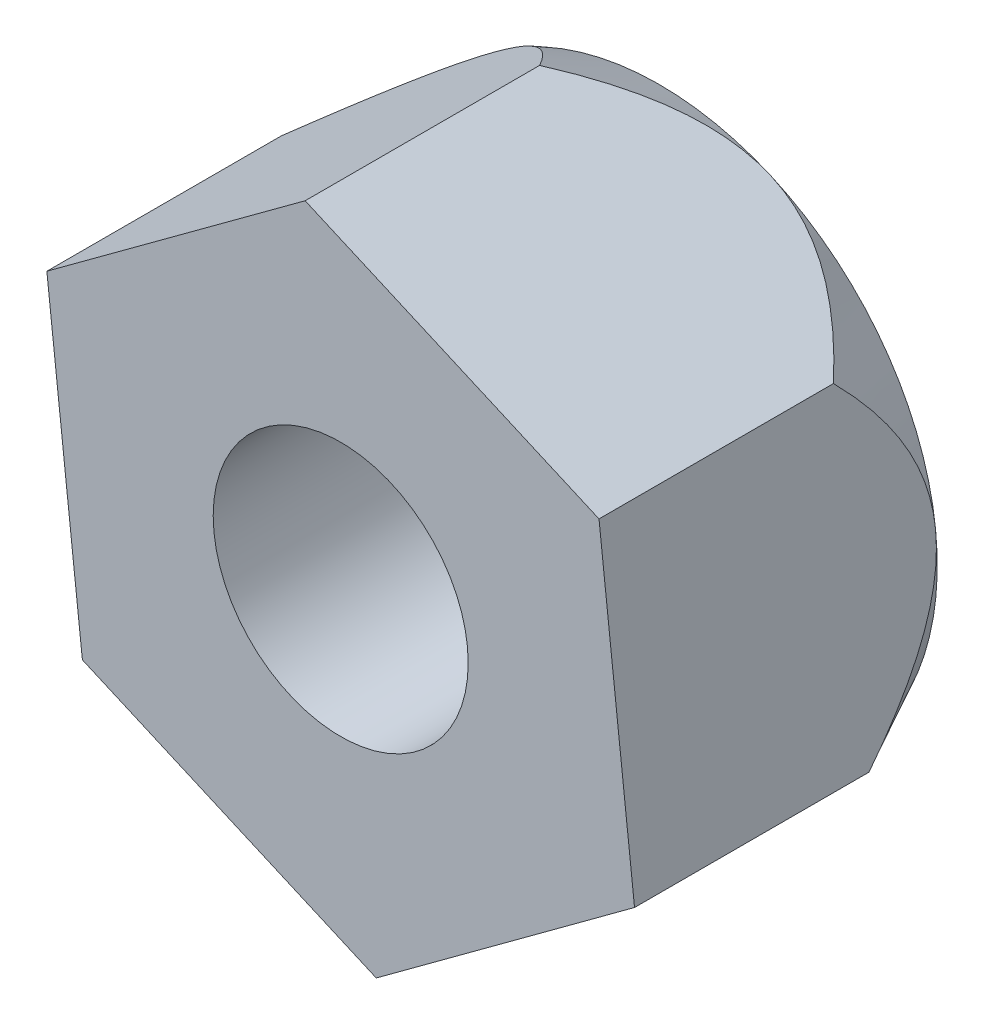
ISO-10303-21;
HEADER;
FILE_DESCRIPTION(('STEP AP214'),'2;1');
FILE_NAME('part.step','',(''),(''),'','','');
FILE_SCHEMA(('AUTOMOTIVE_DESIGN { 1 0 10303 214 1 1 1 1 }'));
ENDSEC;
DATA;
#1=APPLICATION_CONTEXT('core data for automotive mechanical design processes');
#2=APPLICATION_PROTOCOL_DEFINITION('international standard','automotive_design',2000,#1);
#3=PRODUCT_CONTEXT('',#1,'mechanical');
#4=PRODUCT('Part','Part','',(#3));
#5=PRODUCT_RELATED_PRODUCT_CATEGORY('part','',(#4));
#6=PRODUCT_DEFINITION_FORMATION('','',#4);
#7=PRODUCT_DEFINITION_CONTEXT('part definition',#1,'design');
#8=PRODUCT_DEFINITION('design','',#6,#7);
#9=PRODUCT_DEFINITION_SHAPE('','',#8);
#10=(LENGTH_UNIT() NAMED_UNIT(*) SI_UNIT(.MILLI.,.METRE.));
#11=(NAMED_UNIT(*) PLANE_ANGLE_UNIT() SI_UNIT($,.RADIAN.));
#12=(NAMED_UNIT(*) SI_UNIT($,.STERADIAN.) SOLID_ANGLE_UNIT());
#13=UNCERTAINTY_MEASURE_WITH_UNIT(LENGTH_MEASURE(1.E-05),#10,'distance_accuracy_value','');
#14=(GEOMETRIC_REPRESENTATION_CONTEXT(3) GLOBAL_UNCERTAINTY_ASSIGNED_CONTEXT((#13)) GLOBAL_UNIT_ASSIGNED_CONTEXT((#10,
#11,#12)) REPRESENTATION_CONTEXT('',''));
#15=CARTESIAN_POINT('',(0.,0.,0.));
#16=DIRECTION('',(0.,0.,1.));
#17=DIRECTION('',(1.,0.,0.));
#18=AXIS2_PLACEMENT_3D('',#15,#16,#17);
#19=CARTESIAN_POINT('',(0.,0.,0.));
#20=DIRECTION('',(0.,0.,1.));
#21=DIRECTION('',(1.,0.,0.));
#22=AXIS2_PLACEMENT_3D('',#19,#20,#21);
#23=PLANE('',#22);
#24=CARTESIAN_POINT('',(0.,0.,0.));
#25=DIRECTION('',(0.,0.,-1.));
#26=DIRECTION('',(-1.,0.,0.));
#27=AXIS2_PLACEMENT_3D('',#24,#25,#26);
#28=CIRCLE('',#27,2.);
#29=CARTESIAN_POINT('',(-2.,0.,0.));
#30=VERTEX_POINT('',#29);
#31=EDGE_CURVE('E164',#30,#30,#28,.T.);
#32=ORIENTED_EDGE('',*,*,#31,.F.);
#33=EDGE_LOOP('',(#32));
#34=FACE_BOUND('',#33,.T.);
#35=CARTESIAN_POINT('',(0.,0.,0.));
#36=DIRECTION('',(0.,0.,-1.));
#37=DIRECTION('',(-1.,0.,0.));
#38=AXIS2_PLACEMENT_3D('',#35,#36,#37);
#39=CIRCLE('',#38,4.35696877730131);
#40=CARTESIAN_POINT('',(1.7468737262479,3.99144198391049,0.));
#41=VERTEX_POINT('',#40);
#42=CARTESIAN_POINT('',(4.33012701892219,0.482883967820974,0.));
#43=VERTEX_POINT('',#42);
#44=EDGE_CURVE('E152',#41,#43,#39,.T.);
#45=ORIENTED_EDGE('',*,*,#44,.T.);
#46=CARTESIAN_POINT('',(2.58325329267429,-3.50855801608951,0.));
#47=VERTEX_POINT('',#46);
#48=EDGE_CURVE('E141',#43,#47,#39,.T.);
#49=ORIENTED_EDGE('',*,*,#48,.T.);
#50=CARTESIAN_POINT('',(-1.74687372624791,-3.99144198391049,0.));
#51=VERTEX_POINT('',#50);
#52=EDGE_CURVE('E153',#47,#51,#39,.T.);
#53=ORIENTED_EDGE('',*,*,#52,.T.);
#54=CARTESIAN_POINT('',(-4.33012701892219,-0.482883967820975,0.));
#55=VERTEX_POINT('',#54);
#56=EDGE_CURVE('E85',#51,#55,#39,.T.);
#57=ORIENTED_EDGE('',*,*,#56,.T.);
#58=CARTESIAN_POINT('',(-2.58325329267429,3.50855801608951,0.));
#59=VERTEX_POINT('',#58);
#60=EDGE_CURVE('E93',#55,#59,#39,.T.);
#61=ORIENTED_EDGE('',*,*,#60,.T.);
#62=EDGE_CURVE('E172',#59,#41,#39,.T.);
#63=ORIENTED_EDGE('',*,*,#62,.T.);
#64=EDGE_LOOP('',(#45,#49,#53,#57,#61,#63));
#65=FACE_BOUND('',#64,.T.);
#66=ADVANCED_FACE('F64',(#34,#65),#23,.F.);
#67=CARTESIAN_POINT('',(4.33012701892219,0.482883967820974,5.));
#68=DIRECTION('',(-0.993839350302678,-0.110830256653817,0.));
#69=DIRECTION('',(0.110830256653817,-0.993839350302678,0.));
#70=AXIS2_PLACEMENT_3D('',#67,#68,#69);
#71=PLANE('',#70);
#72=CARTESIAN_POINT('',(4.05131152665829,2.98308396782098,1.32304684510144));
#73=CARTESIAN_POINT('',(4.05697597642664,2.93228959769533,1.27289578956966));
#74=CARTESIAN_POINT('',(4.06270317914793,2.8809325080031,1.22332320163949));
#75=CARTESIAN_POINT('',(4.0742984343779,2.77695529751681,1.12550635683434));
#76=CARTESIAN_POINT('',(4.08016652975888,2.72433479227734,1.07726251412321));
#77=CARTESIAN_POINT('',(4.09807421234788,2.56375265372579,0.934233711844905));
#78=CARTESIAN_POINT('',(4.11034670759139,2.45370248270171,0.841783462837));
#79=CARTESIAN_POINT('',(4.13601486940694,2.22353041568287,0.662586395564667));
#80=CARTESIAN_POINT('',(4.14943357137625,2.1032019562015,0.576105574547549));
#81=CARTESIAN_POINT('',(4.17714662756175,1.85469287045311,0.415870591901701));
#82=CARTESIAN_POINT('',(4.19143841332506,1.72653527606945,0.342081326579882));
#83=CARTESIAN_POINT('',(4.21321005166922,1.53130419423075,0.24625814605344));
#84=CARTESIAN_POINT('',(4.22032200964372,1.46752969883432,0.217406500895169));
#85=CARTESIAN_POINT('',(4.23475282176713,1.33812542442336,0.164291655453794));
#86=CARTESIAN_POINT('',(4.24207169887956,1.27249543948986,0.140028966760885));
#87=CARTESIAN_POINT('',(4.26420553120626,1.07401648434333,0.0755143583387216));
#88=CARTESIAN_POINT('',(4.2793198960684,0.938482641795714,0.0429763797723642));
#89=CARTESIAN_POINT('',(4.30237362870574,0.73175473771883,0.013005912123774));
#90=CARTESIAN_POINT('',(4.31017372225658,0.661809578870429,0.00617356568787549));
#91=CARTESIAN_POINT('',(4.32581286145066,0.52156996917169,-0.000775316984884012));
#92=CARTESIAN_POINT('',(4.33365190569912,0.451275530828721,-0.000892091991262691));
#93=CARTESIAN_POINT('',(4.34930157128477,0.310941528655707,0.00561536313815678));
#94=CARTESIAN_POINT('',(4.35711216173875,0.240902241762189,0.0122454935650141));
#95=CARTESIAN_POINT('',(4.37263522995899,0.101703466080383,0.0319724421298808));
#96=CARTESIAN_POINT('',(4.38034765407198,0.0325444584129078,0.0450726529245438));
#97=CARTESIAN_POINT('',(4.39681071631423,-0.115083450939886,0.0797540844893221));
#98=CARTESIAN_POINT('',(4.40553528750034,-0.193318604597908,0.102340621803144));
#99=CARTESIAN_POINT('',(4.42272606835884,-0.347472127249865,0.154509819910642));
#100=CARTESIAN_POINT('',(4.43119207670462,-0.423388690903651,0.18409778298345));
#101=CARTESIAN_POINT('',(4.45626229493011,-0.648198865899436,0.282175562311677));
#102=CARTESIAN_POINT('',(4.47243344691,-0.793209151561192,0.359735202931005));
#103=CARTESIAN_POINT('',(4.49922060166605,-1.03341547502366,0.507152877076127));
#104=CARTESIAN_POINT('',(4.51011890972495,-1.13114300654498,0.573032600979306));
#105=CARTESIAN_POINT('',(4.53140086788801,-1.32198301822171,0.711421075826483));
#106=CARTESIAN_POINT('',(4.54178405219225,-1.41509132144644,0.783935663712783));
#107=CARTESIAN_POINT('',(4.5618505820298,-1.59503231931738,0.932251612373402));
#108=CARTESIAN_POINT('',(4.571544599108,-1.6819607080597,1.00793695507554));
#109=CARTESIAN_POINT('',(4.59052663758815,-1.85217683279049,1.16296043816724));
#110=CARTESIAN_POINT('',(4.5998155619471,-1.9354726657935,1.24228954978413));
#111=CARTESIAN_POINT('',(4.60894251118609,-2.01731603217902,1.32304684510144));
#112=B_SPLINE_CURVE_WITH_KNOTS('',3,(#72,#73,#74,#75,#76,#77,#78,#79,#80,#81,#82,#83,#84,#85,
#86,#87,#88,#89,#90,#91,#92,#93,#94,#95,#96,#97,#98,#99,#100,#101,#102,#103,#104,#105,#106,#107,
#108,#109,#110,#111),.UNSPECIFIED.,.F.,.F.,(4,2,2,2,2,2,2,2,2,2,2,2,2,2,2,2,2,2,2,4),(0.,
0.214805449756146,0.429677112580783,0.862106814968632,1.3079549267317,1.75254930775866,
1.96346140265872,2.17439699681025,2.59259302483563,2.80445529325277,3.01631002898509,
3.22835019487568,3.44050166455576,3.68580122593701,3.93128715407303,4.42516407633933,
4.78001036623598,5.13517188580422,5.48205447569185,5.82811957903112),.UNSPECIFIED.);
#113=CARTESIAN_POINT('',(4.0513338301134,2.98288396782098,1.32284936153611));
#114=VERTEX_POINT('',#113);
#115=EDGE_CURVE('E158',#114,#43,#112,.T.);
#116=ORIENTED_EDGE('',*,*,#115,.F.);
#117=DIRECTION('',(0.,0.,-1.));
#118=VECTOR('',#117,1.);
#119=CARTESIAN_POINT('',(4.0513338301134,2.98288396782098,5.));
#120=LINE('',#119,#118);
#121=CARTESIAN_POINT('',(4.0513338301134,2.98288396782098,5.));
#122=VERTEX_POINT('',#121);
#123=EDGE_CURVE('E256',#122,#114,#120,.T.);
#124=ORIENTED_EDGE('',*,*,#123,.F.);
#125=DIRECTION('',(-0.110830256653817,0.993839350302678,0.));
#126=VECTOR('',#125,1.);
#127=CARTESIAN_POINT('',(4.33012701892219,0.482883967820974,5.));
#128=LINE('',#127,#126);
#129=CARTESIAN_POINT('',(4.60892020773098,-2.01711603217902,5.));
#130=VERTEX_POINT('',#129);
#131=EDGE_CURVE('E249',#130,#122,#128,.T.);
#132=ORIENTED_EDGE('',*,*,#131,.F.);
#133=DIRECTION('',(0.,0.,-1.));
#134=VECTOR('',#133,1.);
#135=CARTESIAN_POINT('',(4.60892020773098,-2.01711603217902,5.));
#136=LINE('',#135,#134);
#137=CARTESIAN_POINT('',(4.60892020773098,-2.01711603217903,1.3228493615361));
#138=VERTEX_POINT('',#137);
#139=EDGE_CURVE('E170',#130,#138,#136,.T.);
#140=ORIENTED_EDGE('',*,*,#139,.T.);
#141=EDGE_CURVE('E145',#43,#138,#112,.T.);
#142=ORIENTED_EDGE('',*,*,#141,.F.);
#143=EDGE_LOOP('',(#116,#124,#132,#140,#142));
#144=FACE_BOUND('',#143,.T.);
#145=ADVANCED_FACE('F167',(#144),#71,.F.);
#146=CARTESIAN_POINT('',(2.58325329267429,-3.50855801608951,5.));
#147=DIRECTION('',(-0.592901492921494,0.805274996315832,0.));
#148=DIRECTION('',(-0.805274996315832,-0.592901492921494,0.));
#149=AXIS2_PLACEMENT_3D('',#146,#147,#148);
#150=PLANE('',#149);
#151=CARTESIAN_POINT('',(4.60912020773098,-2.01696877776392,1.32309308984979));
#152=CARTESIAN_POINT('',(4.56796333073394,-2.04727143701346,1.27294146724886));
#153=CARTESIAN_POINT('',(4.52635050947769,-2.07790979528906,1.22336829305654));
#154=CARTESIAN_POINT('',(4.44210149486611,-2.1399399921397,1.12555023022334));
#155=CARTESIAN_POINT('',(4.39946499003492,-2.17133206004572,1.07730575570329));
#156=CARTESIAN_POINT('',(4.26935111317299,-2.26713127421998,0.934275006298961));
#157=CARTESIAN_POINT('',(4.18018150200631,-2.33278436890917,0.841823356468918));
#158=CARTESIAN_POINT('',(3.99368160552973,-2.4700990347768,0.662623123371584));
#159=CARTESIAN_POINT('',(3.89618395198477,-2.54188383451306,0.576140526291706));
#160=CARTESIAN_POINT('',(3.69482634381533,-2.69013781860664,0.41590148577668));
#161=CARTESIAN_POINT('',(3.59098504970457,-2.76659326374878,0.342109942413736));
#162=CARTESIAN_POINT('',(3.43279627233451,-2.88306324319088,0.24628276500443));
#163=CARTESIAN_POINT('',(3.3811218687912,-2.92110966354023,0.2174296696507));
#164=CARTESIAN_POINT('',(3.27626973560687,-2.99830936126512,0.164311831459064));
#165=CARTESIAN_POINT('',(3.22309183912323,-3.03746276148222,0.140047600162891));
#166=CARTESIAN_POINT('',(3.06227048420635,-3.15587103425873,0.075528254285642));
#167=CARTESIAN_POINT('',(2.95245144735707,-3.23672772445404,0.042986968760258));
#168=CARTESIAN_POINT('',(2.78494556590535,-3.3600576274564,0.013011571913802));
#169=CARTESIAN_POINT('',(2.7282708454643,-3.40178564150643,0.00617757863750978));
#170=CARTESIAN_POINT('',(2.61463826071984,-3.48545014052572,-0.0007744884661904));
#171=CARTESIAN_POINT('',(2.55768040655862,-3.52738661802756,-0.000892801148230922));
#172=CARTESIAN_POINT('',(2.44397113236111,-3.61110758134961,0.00561175162753886));
#173=CARTESIAN_POINT('',(2.38721993649822,-3.65289190211721,0.0122405142790798));
#174=CARTESIAN_POINT('',(2.27443033692179,-3.73593573469717,0.0319649450715522));
#175=CARTESIAN_POINT('',(2.2183923229966,-3.77719495951926,0.045064005928811));
#176=CARTESIAN_POINT('',(2.09877470162006,-3.86526607388185,0.0797426160406733));
#177=CARTESIAN_POINT('',(2.0353844369401,-3.91193855562708,0.102327264773831));
#178=CARTESIAN_POINT('',(1.91048098283004,-4.00390148102736,0.154492579259046));
#179=CARTESIAN_POINT('',(1.84896925602149,-4.04919084779501,0.184078546928766));
#180=CARTESIAN_POINT('',(1.66681563545594,-4.18330547207674,0.282150300691117));
#181=CARTESIAN_POINT('',(1.54932010791968,-4.26981414800306,0.35970586866475));
#182=CARTESIAN_POINT('',(1.354681833256,-4.41312087447007,0.507123782213553));
#183=CARTESIAN_POINT('',(1.27548846842724,-4.47142873756189,0.573008769811819));
#184=CARTESIAN_POINT('',(1.12084189135975,-4.58529069383521,0.711409174842071));
#185=CARTESIAN_POINT('',(1.0453920655774,-4.64084229366345,0.783930432763705));
#186=CARTESIAN_POINT('',(0.899578356922248,-4.74820085557781,0.932260252921922));
#187=CARTESIAN_POINT('',(0.829136911397049,-4.800064924879,1.00795276006792));
#188=CARTESIAN_POINT('',(0.691204458362026,-4.90162073836003,1.16299110837427));
#189=CARTESIAN_POINT('',(0.623706886838754,-4.95131731543968,1.24232791633635));
#190=CARTESIAN_POINT('',(0.557386377617587,-5.00014725441511,1.3230930898498));
#191=B_SPLINE_CURVE_WITH_KNOTS('',3,(#151,#152,#153,#154,#155,#156,#157,#158,#159,#160,#161,
#162,#163,#164,#165,#166,#167,#168,#169,#170,#171,#172,#173,#174,#175,#176,#177,#178,#179,#180,
#181,#182,#183,#184,#185,#186,#187,#188,#189,#190),.UNSPECIFIED.,.F.,.F.,(4,2,2,2,2,2,2,2,2,2,2,
2,2,2,2,2,2,2,2,4),(0.,0.214806341281382,0.429678891317167,0.86211020633669,1.30795993888833,
1.75255602098628,1.96347007288073,2.17440762249158,2.59260767403642,2.80447220374995,
3.01632919813546,3.22837152252291,3.44052515002694,3.685819293709,3.93129979010489,
4.42516609541874,4.78004580476074,5.135240899068,5.48215516216426,5.82825159400008),.UNSPECIFIED.);
#192=EDGE_CURVE('E147',#138,#47,#191,.T.);
#193=ORIENTED_EDGE('',*,*,#192,.F.);
#194=ORIENTED_EDGE('',*,*,#139,.F.);
#195=DIRECTION('',(0.805274996315832,0.592901492921494,0.));
#196=VECTOR('',#195,1.);
#197=CARTESIAN_POINT('',(2.58325329267429,-3.50855801608951,5.));
#198=LINE('',#197,#196);
#199=CARTESIAN_POINT('',(0.557586377617587,-5.,5.));
#200=VERTEX_POINT('',#199);
#201=EDGE_CURVE('E254',#200,#130,#198,.T.);
#202=ORIENTED_EDGE('',*,*,#201,.F.);
#203=DIRECTION('',(0.,0.,-1.));
#204=VECTOR('',#203,1.);
#205=CARTESIAN_POINT('',(0.557586377617587,-5.,5.));
#206=LINE('',#205,#204);
#207=CARTESIAN_POINT('',(0.557586377617588,-5.,1.32284936153611));
#208=VERTEX_POINT('',#207);
#209=EDGE_CURVE('E283',#200,#208,#206,.T.);
#210=ORIENTED_EDGE('',*,*,#209,.T.);
#211=EDGE_CURVE('E216',#47,#208,#191,.T.);
#212=ORIENTED_EDGE('',*,*,#211,.F.);
#213=EDGE_LOOP('',(#193,#194,#202,#210,#212));
#214=FACE_BOUND('',#213,.T.);
#215=ADVANCED_FACE('F225',(#214),#150,.F.);
#216=CARTESIAN_POINT('',(-1.74687372624791,-3.99144198391049,5.));
#217=DIRECTION('',(0.400937857381184,0.91610525296965,0.));
#218=DIRECTION('',(-0.91610525296965,0.400937857381184,0.));
#219=AXIS2_PLACEMENT_3D('',#216,#217,#218);
#220=PLANE('',#219);
#221=CARTESIAN_POINT('',(0.557786377617588,-5.00008753095915,1.32306360268057));
#222=CARTESIAN_POINT('',(0.51096498442736,-4.97959592368538,1.27291234166088));
#223=CARTESIAN_POINT('',(0.463624888909057,-4.95887730385016,1.22333954128774));
#224=CARTESIAN_POINT('',(0.367780464214936,-4.91693053173612,1.12552225510722));
#225=CARTESIAN_POINT('',(0.319275780674802,-4.89570222436806,1.07727818344811));
#226=CARTESIAN_POINT('',(0.171253931333777,-4.830919752127,0.934248675591187));
#227=CARTESIAN_POINT('',(0.0698115986354528,-4.78652302872871,0.841797918967731));
#228=CARTESIAN_POINT('',(-0.142356976816966,-4.69366643417283,0.662599704491717));
#229=CARTESIAN_POINT('',(-0.253273625139168,-4.64512323110523,0.576118239878892));
#230=CARTESIAN_POINT('',(-0.482344903739923,-4.54486908745521,0.415881786773756));
#231=CARTESIAN_POINT('',(-0.600478304196153,-4.49316743820635,0.342091695952821));
#232=CARTESIAN_POINT('',(-0.780439001997119,-4.41440677576582,0.246267067071715));
#233=CARTESIAN_POINT('',(-0.839225334474916,-4.38867865543189,0.217414896407212));
#234=CARTESIAN_POINT('',(-0.958508191468611,-4.3364739410169,0.164298966485052));
#235=CARTESIAN_POINT('',(-1.01900490579458,-4.30999726386454,0.140035718800028));
#236=CARTESIAN_POINT('',(-1.20195982630362,-4.22992616549625,0.0755193936702294));
#237=CARTESIAN_POINT('',(-1.32689295261116,-4.17524858361873,0.0429802167643567));
#238=CARTESIAN_POINT('',(-1.51745190184293,-4.09184954561285,0.0130079629298236));
#239=CARTESIAN_POINT('',(-1.58192643207479,-4.06363195825264,0.00617501973153718));
#240=CARTESIAN_POINT('',(-1.711197515516,-4.00705584863177,-0.000775016876504111));
#241=CARTESIAN_POINT('',(-1.775994057193,-3.97869733141831,-0.000892349086619426));
#242=CARTESIAN_POINT('',(-1.9053522351835,-3.92208310445026,0.00561405432449662));
#243=CARTESIAN_POINT('',(-1.96991361631165,-3.89382750637877,0.0122436891144507));
#244=CARTESIAN_POINT('',(-2.09822542728777,-3.83767122695269,0.0319697253214013));
#245=CARTESIAN_POINT('',(-2.16197541366599,-3.80977073968476,0.0450695194166783));
#246=CARTESIAN_POINT('',(-2.29805631316014,-3.75021428141009,0.0797499285657548));
#247=CARTESIAN_POINT('',(-2.37017178394968,-3.71865259977071,0.102335781505209));
#248=CARTESIAN_POINT('',(-2.51226720743945,-3.65646385622516,0.154503572285038));
#249=CARTESIAN_POINT('',(-2.58224549608246,-3.62583752260162,0.184090812273558));
#250=CARTESIAN_POINT('',(-2.78947085884277,-3.53514434878689,0.282166408087124));
#251=CARTESIAN_POINT('',(-2.92313841273026,-3.4766441027908,0.359724572880906));
#252=CARTESIAN_POINT('',(-3.14455968446084,-3.3797380213351,0.507142333796174));
#253=CARTESIAN_POINT('',(-3.23464665886239,-3.34031102495294,0.573023965125107));
#254=CARTESIAN_POINT('',(-3.41056622610134,-3.26331898268316,0.711416763134474));
#255=CARTESIAN_POINT('',(-3.49639496787466,-3.2257556222322,0.783933768042475));
#256=CARTESIAN_POINT('',(-3.66226727270105,-3.15316081254151,0.932254743317763));
#257=CARTESIAN_POINT('',(-3.7423990553116,-3.11809075358937,1.00794268219947));
#258=CARTESIAN_POINT('',(-3.89930650310873,-3.04941945657082,1.16297155199897));
#259=CARTESIAN_POINT('',(-3.97608963334264,-3.01581495139065,1.24230345254059));
#260=CARTESIAN_POINT('',(-4.0515338301134,-2.98279643686182,1.32306360268057));
#261=B_SPLINE_CURVE_WITH_KNOTS('',3,(#221,#222,#223,#224,#225,#226,#227,#228,#229,#230,#231,
#232,#233,#234,#235,#236,#237,#238,#239,#240,#241,#242,#243,#244,#245,#246,#247,#248,#249,#250,
#251,#252,#253,#254,#255,#256,#257,#258,#259,#260),.UNSPECIFIED.,.F.,.F.,(4,2,2,2,2,2,2,2,2,2,2,
2,2,2,2,2,2,2,2,4),(0.,0.214805772811258,0.429677757127679,0.862108043870434,1.30795674295667,
1.75255174039904,1.96346454443766,2.17440084717146,2.59259833316212,2.80446142098691,
3.01631697516907,3.2283579232168,3.44051017481028,3.6858077729349,3.93129173272618,
4.42516480763886,4.78002320774883,5.1351968937983,5.48209096114113,5.82816741703406),.UNSPECIFIED.);
#262=EDGE_CURVE('E214',#208,#51,#261,.T.);
#263=ORIENTED_EDGE('',*,*,#262,.F.);
#264=ORIENTED_EDGE('',*,*,#209,.F.);
#265=DIRECTION('',(0.91610525296965,-0.400937857381184,0.));
#266=VECTOR('',#265,1.);
#267=CARTESIAN_POINT('',(-1.74687372624791,-3.99144198391049,5.));
#268=LINE('',#267,#266);
#269=CARTESIAN_POINT('',(-4.0513338301134,-2.98288396782097,5.));
#270=VERTEX_POINT('',#269);
#271=EDGE_CURVE('E275',#270,#200,#268,.T.);
#272=ORIENTED_EDGE('',*,*,#271,.F.);
#273=DIRECTION('',(0.,0.,-1.));
#274=VECTOR('',#273,1.);
#275=CARTESIAN_POINT('',(-4.0513338301134,-2.98288396782097,5.));
#276=LINE('',#275,#274);
#277=CARTESIAN_POINT('',(-4.0513338301134,-2.98288396782097,1.32284936153611));
#278=VERTEX_POINT('',#277);
#279=EDGE_CURVE('E257',#270,#278,#276,.T.);
#280=ORIENTED_EDGE('',*,*,#279,.T.);
#281=EDGE_CURVE('E209',#51,#278,#261,.T.);
#282=ORIENTED_EDGE('',*,*,#281,.F.);
#283=EDGE_LOOP('',(#263,#264,#272,#280,#282));
#284=FACE_BOUND('',#283,.T.);
#285=ADVANCED_FACE('F222',(#284),#220,.F.);
#286=CARTESIAN_POINT('',(-4.60892020773099,2.01711603217902,5.));
#287=DIRECTION('',(0.993839350302678,0.110830256653818,0.));
#288=DIRECTION('',(-0.110830256653818,0.993839350302678,0.));
#289=AXIS2_PLACEMENT_3D('',#286,#287,#288);
#290=PLANE('',#289);
#291=CARTESIAN_POINT('',(-4.05131152665829,-2.98308396782097,1.32304684510144));
#292=CARTESIAN_POINT('',(-4.05697597642664,-2.93228959769533,1.27289578956966));
#293=CARTESIAN_POINT('',(-4.06270317914793,-2.8809325080031,1.22332320163948));
#294=CARTESIAN_POINT('',(-4.0742984343779,-2.77695529751681,1.12550635683434));
#295=CARTESIAN_POINT('',(-4.08016652975888,-2.72433479227734,1.07726251412321));
#296=CARTESIAN_POINT('',(-4.09807421234788,-2.56375265372579,0.934233711844903));
#297=CARTESIAN_POINT('',(-4.11034670759139,-2.45370248270171,0.841783462836998));
#298=CARTESIAN_POINT('',(-4.13601486940694,-2.22353041568287,0.662586395564664));
#299=CARTESIAN_POINT('',(-4.14943357137625,-2.10320195620149,0.576105574547546));
#300=CARTESIAN_POINT('',(-4.17714662756175,-1.85469287045311,0.415870591901699));
#301=CARTESIAN_POINT('',(-4.19143841332506,-1.72653527606945,0.34208132657988));
#302=CARTESIAN_POINT('',(-4.21321005166922,-1.53130419423075,0.246258146053438));
#303=CARTESIAN_POINT('',(-4.22032200964372,-1.46752969883432,0.217406500895167));
#304=CARTESIAN_POINT('',(-4.23475282176713,-1.33812542442336,0.164291655453793));
#305=CARTESIAN_POINT('',(-4.24207169887956,-1.27249543948985,0.140028966760885));
#306=CARTESIAN_POINT('',(-4.26420553120626,-1.07401648434333,0.0755143583387233));
#307=CARTESIAN_POINT('',(-4.2793198960684,-0.938482641795712,0.0429763797723652));
#308=CARTESIAN_POINT('',(-4.30237362870574,-0.731754737718829,0.0130059121237741));
#309=CARTESIAN_POINT('',(-4.31017372225658,-0.661809578870428,0.00617356568787531));
#310=CARTESIAN_POINT('',(-4.32581286145066,-0.52156996917169,-0.000775316984883216));
#311=CARTESIAN_POINT('',(-4.33365190569912,-0.45127553082872,-0.000892091991260673));
#312=CARTESIAN_POINT('',(-4.34930157128477,-0.310941528655706,0.00561536313815883));
#313=CARTESIAN_POINT('',(-4.35711216173875,-0.240902241762189,0.012245493565015));
#314=CARTESIAN_POINT('',(-4.37263522995899,-0.101703466080383,0.0319724421298808));
#315=CARTESIAN_POINT('',(-4.38034765407198,-0.0325444584129079,0.0450726529245441));
#316=CARTESIAN_POINT('',(-4.39681071631423,0.115083450939886,0.0797540844893227));
#317=CARTESIAN_POINT('',(-4.40553528750034,0.193318604597907,0.102340621803145));
#318=CARTESIAN_POINT('',(-4.42272606835884,0.347472127249865,0.154509819910642));
#319=CARTESIAN_POINT('',(-4.43119207670462,0.423388690903652,0.18409778298345));
#320=CARTESIAN_POINT('',(-4.45626229493011,0.648198865899436,0.282175562311678));
#321=CARTESIAN_POINT('',(-4.47243344691,0.793209151561192,0.359735202931006));
#322=CARTESIAN_POINT('',(-4.49922060166605,1.03341547502366,0.507152877076128));
#323=CARTESIAN_POINT('',(-4.51011890972495,1.13114300654498,0.573032600979307));
#324=CARTESIAN_POINT('',(-4.53140086788801,1.32198301822171,0.711421075826483));
#325=CARTESIAN_POINT('',(-4.54178405219225,1.41509132144644,0.783935663712783));
#326=CARTESIAN_POINT('',(-4.5618505820298,1.59503231931738,0.932251612373401));
#327=CARTESIAN_POINT('',(-4.571544599108,1.6819607080597,1.00793695507554));
#328=CARTESIAN_POINT('',(-4.59052663758815,1.85217683279049,1.16296043816724));
#329=CARTESIAN_POINT('',(-4.5998155619471,1.9354726657935,1.24228954978413));
#330=CARTESIAN_POINT('',(-4.60894251118609,2.01731603217902,1.32304684510144));
#331=B_SPLINE_CURVE_WITH_KNOTS('',3,(#291,#292,#293,#294,#295,#296,#297,#298,#299,#300,#301,
#302,#303,#304,#305,#306,#307,#308,#309,#310,#311,#312,#313,#314,#315,#316,#317,#318,#319,#320,
#321,#322,#323,#324,#325,#326,#327,#328,#329,#330),.UNSPECIFIED.,.F.,.F.,(4,2,2,2,2,2,2,2,2,2,2,
2,2,2,2,2,2,2,2,4),(0.,0.214805449756146,0.429677112580783,0.862106814968633,1.3079549267317,
1.75254930775866,1.96346140265872,2.17439699681025,2.59259302483563,2.80445529325277,
3.01631002898509,3.22835019487568,3.44050166455576,3.68580122593701,3.93128715407302,
4.42516407633932,4.78001036623598,5.13517188580422,5.48205447569185,5.82811957903112),.UNSPECIFIED.);
#332=EDGE_CURVE('E215',#278,#55,#331,.T.);
#333=ORIENTED_EDGE('',*,*,#332,.F.);
#334=ORIENTED_EDGE('',*,*,#279,.F.);
#335=DIRECTION('',(0.110830256653818,-0.993839350302678,0.));
#336=VECTOR('',#335,1.);
#337=CARTESIAN_POINT('',(-4.60892020773099,2.01711603217902,5.));
#338=LINE('',#337,#336);
#339=CARTESIAN_POINT('',(-4.60892020773099,2.01711603217902,5.));
#340=VERTEX_POINT('',#339);
#341=EDGE_CURVE('E264',#340,#270,#338,.T.);
#342=ORIENTED_EDGE('',*,*,#341,.F.);
#343=DIRECTION('',(0.,0.,-1.));
#344=VECTOR('',#343,1.);
#345=CARTESIAN_POINT('',(-4.60892020773099,2.01711603217902,5.));
#346=LINE('',#345,#344);
#347=CARTESIAN_POINT('',(-4.60892020773099,2.01711603217902,1.3228493615361));
#348=VERTEX_POINT('',#347);
#349=EDGE_CURVE('E266',#340,#348,#346,.T.);
#350=ORIENTED_EDGE('',*,*,#349,.T.);
#351=EDGE_CURVE('E182',#55,#348,#331,.T.);
#352=ORIENTED_EDGE('',*,*,#351,.F.);
#353=EDGE_LOOP('',(#333,#334,#342,#350,#352));
#354=FACE_BOUND('',#353,.T.);
#355=ADVANCED_FACE('F66',(#354),#290,.F.);
#356=CARTESIAN_POINT('',(-0.557586377617588,5.,5.));
#357=DIRECTION('',(0.592901492921494,-0.805274996315832,0.));
#358=DIRECTION('',(0.805274996315832,0.592901492921494,0.));
#359=AXIS2_PLACEMENT_3D('',#356,#357,#358);
#360=PLANE('',#359);
#361=CARTESIAN_POINT('',(-4.60912020773099,2.01696877776392,1.32309308984979));
#362=CARTESIAN_POINT('',(-4.56796333073394,2.04727143701346,1.27294146724886));
#363=CARTESIAN_POINT('',(-4.52635050947769,2.07790979528905,1.22336829305654));
#364=CARTESIAN_POINT('',(-4.44210149486611,2.1399399921397,1.12555023022334));
#365=CARTESIAN_POINT('',(-4.39946499003492,2.17133206004572,1.07730575570329));
#366=CARTESIAN_POINT('',(-4.26935111317299,2.26713127421998,0.934275006298962));
#367=CARTESIAN_POINT('',(-4.18018150200631,2.33278436890917,0.841823356468917));
#368=CARTESIAN_POINT('',(-3.99368160552973,2.4700990347768,0.662623123371582));
#369=CARTESIAN_POINT('',(-3.89618395198477,2.54188383451306,0.576140526291705));
#370=CARTESIAN_POINT('',(-3.69482634381533,2.69013781860663,0.415901485776679));
#371=CARTESIAN_POINT('',(-3.59098504970457,2.76659326374878,0.342109942413735));
#372=CARTESIAN_POINT('',(-3.43279627233451,2.88306324319087,0.246282765004429));
#373=CARTESIAN_POINT('',(-3.3811218687912,2.92110966354023,0.217429669650699));
#374=CARTESIAN_POINT('',(-3.27626973560687,2.99830936126512,0.164311831459064));
#375=CARTESIAN_POINT('',(-3.22309183912323,3.03746276148221,0.140047600162891));
#376=CARTESIAN_POINT('',(-3.06227048420635,3.15587103425873,0.0755282542856412));
#377=CARTESIAN_POINT('',(-2.95245144735707,3.23672772445404,0.0429869687602561));
#378=CARTESIAN_POINT('',(-2.78494556590535,3.3600576274564,0.0130115719138005));
#379=CARTESIAN_POINT('',(-2.7282708454643,3.40178564150643,0.00617757863750869));
#380=CARTESIAN_POINT('',(-2.61463826071984,3.48545014052572,-0.000774488466191833));
#381=CARTESIAN_POINT('',(-2.55768040655862,3.52738661802756,-0.000892801148233125));
#382=CARTESIAN_POINT('',(-2.44397113236111,3.61110758134961,0.00561175162753629));
#383=CARTESIAN_POINT('',(-2.38721993649822,3.6528919021172,0.0122405142790776));
#384=CARTESIAN_POINT('',(-2.27443033692179,3.73593573469717,0.0319649450715497));
#385=CARTESIAN_POINT('',(-2.2183923229966,3.77719495951926,0.0450640059288077));
#386=CARTESIAN_POINT('',(-2.09877470162006,3.86526607388185,0.0797426160406693));
#387=CARTESIAN_POINT('',(-2.0353844369401,3.91193855562708,0.102327264773827));
#388=CARTESIAN_POINT('',(-1.91048098283004,4.00390148102735,0.154492579259043));
#389=CARTESIAN_POINT('',(-1.84896925602149,4.04919084779501,0.184078546928762));
#390=CARTESIAN_POINT('',(-1.66681563545594,4.18330547207674,0.282150300691113));
#391=CARTESIAN_POINT('',(-1.54932010791968,4.26981414800305,0.359705868664747));
#392=CARTESIAN_POINT('',(-1.354681833256,4.41312087447007,0.50712378221355));
#393=CARTESIAN_POINT('',(-1.27548846842724,4.47142873756189,0.573008769811815));
#394=CARTESIAN_POINT('',(-1.12084189135975,4.58529069383521,0.711409174842067));
#395=CARTESIAN_POINT('',(-1.0453920655774,4.64084229366345,0.783930432763702));
#396=CARTESIAN_POINT('',(-0.899578356922248,4.74820085557781,0.932260252921919));
#397=CARTESIAN_POINT('',(-0.829136911397049,4.800064924879,1.00795276006792));
#398=CARTESIAN_POINT('',(-0.691204458362026,4.90162073836003,1.16299110837426));
#399=CARTESIAN_POINT('',(-0.623706886838754,4.95131731543967,1.24232791633634));
#400=CARTESIAN_POINT('',(-0.557386377617588,5.00014725441511,1.32309308984979));
#401=B_SPLINE_CURVE_WITH_KNOTS('',3,(#361,#362,#363,#364,#365,#366,#367,#368,#369,#370,#371,
#372,#373,#374,#375,#376,#377,#378,#379,#380,#381,#382,#383,#384,#385,#386,#387,#388,#389,#390,
#391,#392,#393,#394,#395,#396,#397,#398,#399,#400),.UNSPECIFIED.,.F.,.F.,(4,2,2,2,2,2,2,2,2,2,2,
2,2,2,2,2,2,2,2,4),(0.,0.214806341281381,0.429678891317167,0.86211020633669,1.30795993888833,
1.75255602098628,1.96347007288073,2.17440762249158,2.59260767403642,2.80447220374995,
3.01632919813546,3.22837152252291,3.44052515002694,3.685819293709,3.93129979010489,
4.42516609541874,4.78004580476075,5.135240899068,5.48215516216426,5.82825159400008),.UNSPECIFIED.);
#402=EDGE_CURVE('E181',#348,#59,#401,.T.);
#403=ORIENTED_EDGE('',*,*,#402,.F.);
#404=ORIENTED_EDGE('',*,*,#349,.F.);
#405=DIRECTION('',(-0.805274996315832,-0.592901492921494,0.));
#406=VECTOR('',#405,1.);
#407=CARTESIAN_POINT('',(-0.557586377617588,5.,5.));
#408=LINE('',#407,#406);
#409=CARTESIAN_POINT('',(-0.557586377617588,5.,5.));
#410=VERTEX_POINT('',#409);
#411=EDGE_CURVE('E263',#410,#340,#408,.T.);
#412=ORIENTED_EDGE('',*,*,#411,.F.);
#413=DIRECTION('',(0.,0.,-1.));
#414=VECTOR('',#413,1.);
#415=CARTESIAN_POINT('',(-0.557586377617588,5.,5.));
#416=LINE('',#415,#414);
#417=CARTESIAN_POINT('',(-0.557586377617588,5.,1.32284936153611));
#418=VERTEX_POINT('',#417);
#419=EDGE_CURVE('E258',#410,#418,#416,.T.);
#420=ORIENTED_EDGE('',*,*,#419,.T.);
#421=EDGE_CURVE('E173',#59,#418,#401,.T.);
#422=ORIENTED_EDGE('',*,*,#421,.F.);
#423=EDGE_LOOP('',(#403,#404,#412,#420,#422));
#424=FACE_BOUND('',#423,.T.);
#425=ADVANCED_FACE('F188',(#424),#360,.F.);
#426=CARTESIAN_POINT('',(4.0513338301134,2.98288396782098,5.));
#427=DIRECTION('',(-0.400937857381183,-0.91610525296965,0.));
#428=DIRECTION('',(0.91610525296965,-0.400937857381183,0.));
#429=AXIS2_PLACEMENT_3D('',#426,#427,#428);
#430=PLANE('',#429);
#431=CARTESIAN_POINT('',(-0.557786377617588,5.00008753095915,1.32306360268057));
#432=CARTESIAN_POINT('',(-0.51096498442736,4.97959592368538,1.27291234166088));
#433=CARTESIAN_POINT('',(-0.463624888909058,4.95887730385016,1.22333954128774));
#434=CARTESIAN_POINT('',(-0.367780464214936,4.91693053173612,1.12552225510722));
#435=CARTESIAN_POINT('',(-0.319275780674803,4.89570222436806,1.07727818344811));
#436=CARTESIAN_POINT('',(-0.171253931333778,4.830919752127,0.934248675591187));
#437=CARTESIAN_POINT('',(-0.069811598635453,4.78652302872871,0.84179791896773));
#438=CARTESIAN_POINT('',(0.142356976816966,4.69366643417283,0.662599704491717));
#439=CARTESIAN_POINT('',(0.253273625139168,4.64512323110523,0.576118239878891));
#440=CARTESIAN_POINT('',(0.482344903739922,4.54486908745521,0.415881786773756));
#441=CARTESIAN_POINT('',(0.600478304196153,4.49316743820635,0.342091695952821));
#442=CARTESIAN_POINT('',(0.780439001997119,4.41440677576582,0.246267067071715));
#443=CARTESIAN_POINT('',(0.839225334474916,4.38867865543189,0.217414896407212));
#444=CARTESIAN_POINT('',(0.958508191468611,4.3364739410169,0.164298966485051));
#445=CARTESIAN_POINT('',(1.01900490579458,4.30999726386454,0.140035718800028));
#446=CARTESIAN_POINT('',(1.20195982630362,4.22992616549625,0.0755193936702294));
#447=CARTESIAN_POINT('',(1.32689295261116,4.17524858361873,0.0429802167643572));
#448=CARTESIAN_POINT('',(1.51745190184293,4.09184954561285,0.0130079629298239));
#449=CARTESIAN_POINT('',(1.58192643207479,4.06363195825264,0.00617501973153724));
#450=CARTESIAN_POINT('',(1.711197515516,4.00705584863177,-0.000775016876503605));
#451=CARTESIAN_POINT('',(1.775994057193,3.97869733141831,-0.000892349086618201));
#452=CARTESIAN_POINT('',(1.9053522351835,3.92208310445026,0.00561405432449813));
#453=CARTESIAN_POINT('',(1.96991361631166,3.89382750637877,0.0122436891144518));
#454=CARTESIAN_POINT('',(2.09822542728777,3.83767122695269,0.0319697253214016));
#455=CARTESIAN_POINT('',(2.16197541366599,3.80977073968476,0.0450695194166783));
#456=CARTESIAN_POINT('',(2.29805631316014,3.75021428141009,0.0797499285657553));
#457=CARTESIAN_POINT('',(2.37017178394968,3.71865259977071,0.10233578150521));
#458=CARTESIAN_POINT('',(2.51226720743945,3.65646385622516,0.15450357228504));
#459=CARTESIAN_POINT('',(2.58224549608246,3.62583752260162,0.18409081227356));
#460=CARTESIAN_POINT('',(2.78947085884277,3.53514434878689,0.282166408087125));
#461=CARTESIAN_POINT('',(2.92313841273027,3.4766441027908,0.359724572880908));
#462=CARTESIAN_POINT('',(3.14455968446084,3.3797380213351,0.507142333796175));
#463=CARTESIAN_POINT('',(3.23464665886239,3.34031102495294,0.573023965125108));
#464=CARTESIAN_POINT('',(3.41056622610134,3.26331898268316,0.711416763134475));
#465=CARTESIAN_POINT('',(3.49639496787467,3.2257556222322,0.783933768042476));
#466=CARTESIAN_POINT('',(3.66226727270105,3.15316081254151,0.932254743317764));
#467=CARTESIAN_POINT('',(3.7423990553116,3.11809075358937,1.00794268219947));
#468=CARTESIAN_POINT('',(3.89930650310873,3.04941945657083,1.16297155199897));
#469=CARTESIAN_POINT('',(3.97608963334264,3.01581495139065,1.24230345254059));
#470=CARTESIAN_POINT('',(4.0515338301134,2.98279643686182,1.32306360268057));
#471=B_SPLINE_CURVE_WITH_KNOTS('',3,(#431,#432,#433,#434,#435,#436,#437,#438,#439,#440,#441,
#442,#443,#444,#445,#446,#447,#448,#449,#450,#451,#452,#453,#454,#455,#456,#457,#458,#459,#460,
#461,#462,#463,#464,#465,#466,#467,#468,#469,#470),.UNSPECIFIED.,.F.,.F.,(4,2,2,2,2,2,2,2,2,2,2,
2,2,2,2,2,2,2,2,4),(0.,0.214805772811259,0.429677757127679,0.862108043870435,1.30795674295667,
1.75255174039904,1.96346454443766,2.17440084717146,2.59259833316212,2.80446142098691,
3.01631697516907,3.22835792321681,3.44051017481028,3.6858077729349,3.93129173272618,
4.42516480763886,4.78002320774883,5.1351968937983,5.48209096114113,5.82816741703406),.UNSPECIFIED.);
#472=EDGE_CURVE('E13',#418,#41,#471,.T.);
#473=ORIENTED_EDGE('',*,*,#472,.F.);
#474=ORIENTED_EDGE('',*,*,#419,.F.);
#475=DIRECTION('',(-0.91610525296965,0.400937857381183,0.));
#476=VECTOR('',#475,1.);
#477=CARTESIAN_POINT('',(4.0513338301134,2.98288396782098,5.));
#478=LINE('',#477,#476);
#479=EDGE_CURVE('E251',#122,#410,#478,.T.);
#480=ORIENTED_EDGE('',*,*,#479,.F.);
#481=ORIENTED_EDGE('',*,*,#123,.T.);
#482=EDGE_CURVE('E69',#41,#114,#471,.T.);
#483=ORIENTED_EDGE('',*,*,#482,.F.);
#484=EDGE_LOOP('',(#473,#474,#480,#481,#483));
#485=FACE_BOUND('',#484,.T.);
#486=ADVANCED_FACE('F237',(#485),#430,.F.);
#487=CARTESIAN_POINT('',(0.,0.,5.));
#488=DIRECTION('',(0.,0.,1.));
#489=DIRECTION('',(1.,0.,0.));
#490=AXIS2_PLACEMENT_3D('',#487,#488,#489);
#491=PLANE('',#490);
#492=CARTESIAN_POINT('',(0.,0.,5.));
#493=DIRECTION('',(0.,0.,-1.));
#494=DIRECTION('',(-1.,0.,0.));
#495=AXIS2_PLACEMENT_3D('',#492,#493,#494);
#496=CIRCLE('',#495,2.);
#497=CARTESIAN_POINT('',(-2.,0.,5.));
#498=VERTEX_POINT('',#497);
#499=EDGE_CURVE('E248',#498,#498,#496,.T.);
#500=ORIENTED_EDGE('',*,*,#499,.T.);
#501=EDGE_LOOP('',(#500));
#502=FACE_BOUND('',#501,.T.);
#503=ORIENTED_EDGE('',*,*,#131,.T.);
#504=ORIENTED_EDGE('',*,*,#479,.T.);
#505=ORIENTED_EDGE('',*,*,#411,.T.);
#506=ORIENTED_EDGE('',*,*,#341,.T.);
#507=ORIENTED_EDGE('',*,*,#271,.T.);
#508=ORIENTED_EDGE('',*,*,#201,.T.);
#509=EDGE_LOOP('',(#503,#504,#505,#506,#507,#508));
#510=FACE_BOUND('',#509,.T.);
#511=ADVANCED_FACE('F235',(#502,#510),#491,.T.);
#512=CARTESIAN_POINT('',(0.,0.,5.));
#513=DIRECTION('',(0.,0.,-1.));
#514=DIRECTION('',(-1.,0.,0.));
#515=AXIS2_PLACEMENT_3D('',#512,#513,#514);
#516=CYLINDRICAL_SURFACE('',#515,2.);
#517=ORIENTED_EDGE('',*,*,#499,.F.);
#518=EDGE_LOOP('',(#517));
#519=FACE_BOUND('',#518,.T.);
#520=ORIENTED_EDGE('',*,*,#31,.T.);
#521=EDGE_LOOP('',(#520));
#522=FACE_BOUND('',#521,.T.);
#523=ADVANCED_FACE('F195',(#519,#522),#516,.F.);
#524=CARTESIAN_POINT('',(0.,0.,0.));
#525=DIRECTION('',(0.,0.,1.));
#526=DIRECTION('',(-1.,0.,0.));
#527=AXIS2_PLACEMENT_3D('',#524,#525,#526);
#528=CONICAL_SURFACE('',#527,4.35696877730131,0.471238898038469);
#529=ORIENTED_EDGE('',*,*,#115,.T.);
#530=ORIENTED_EDGE('',*,*,#44,.F.);
#531=ORIENTED_EDGE('',*,*,#482,.T.);
#532=EDGE_LOOP('',(#529,#530,#531));
#533=FACE_BOUND('',#532,.T.);
#534=ADVANCED_FACE('F159',(#533),#528,.T.);
#535=ORIENTED_EDGE('',*,*,#421,.T.);
#536=ORIENTED_EDGE('',*,*,#472,.T.);
#537=ORIENTED_EDGE('',*,*,#62,.F.);
#538=EDGE_LOOP('',(#535,#536,#537));
#539=FACE_BOUND('',#538,.T.);
#540=ADVANCED_FACE('F194',(#539),#528,.T.);
#541=ORIENTED_EDGE('',*,*,#351,.T.);
#542=ORIENTED_EDGE('',*,*,#402,.T.);
#543=ORIENTED_EDGE('',*,*,#60,.F.);
#544=EDGE_LOOP('',(#541,#542,#543));
#545=FACE_BOUND('',#544,.T.);
#546=ADVANCED_FACE('F294',(#545),#528,.T.);
#547=ORIENTED_EDGE('',*,*,#281,.T.);
#548=ORIENTED_EDGE('',*,*,#332,.T.);
#549=ORIENTED_EDGE('',*,*,#56,.F.);
#550=EDGE_LOOP('',(#547,#548,#549));
#551=FACE_BOUND('',#550,.T.);
#552=ADVANCED_FACE('F289',(#551),#528,.T.);
#553=ORIENTED_EDGE('',*,*,#211,.T.);
#554=ORIENTED_EDGE('',*,*,#262,.T.);
#555=ORIENTED_EDGE('',*,*,#52,.F.);
#556=EDGE_LOOP('',(#553,#554,#555));
#557=FACE_BOUND('',#556,.T.);
#558=ADVANCED_FACE('F287',(#557),#528,.T.);
#559=ORIENTED_EDGE('',*,*,#141,.T.);
#560=ORIENTED_EDGE('',*,*,#192,.T.);
#561=ORIENTED_EDGE('',*,*,#48,.F.);
#562=EDGE_LOOP('',(#559,#560,#561));
#563=FACE_BOUND('',#562,.T.);
#564=ADVANCED_FACE('F143',(#563),#528,.T.);
#565=CLOSED_SHELL('',(#66,#145,#215,#285,#355,#425,#486,#511,#523,#534,#540,#546,#552,#558,#564));
#566=MANIFOLD_SOLID_BREP('B2',#565);
#567=ADVANCED_BREP_SHAPE_REPRESENTATION('',(#18,#566),#14);
#568=SHAPE_DEFINITION_REPRESENTATION(#9,#567);
ENDSEC;
END-ISO-10303-21;
